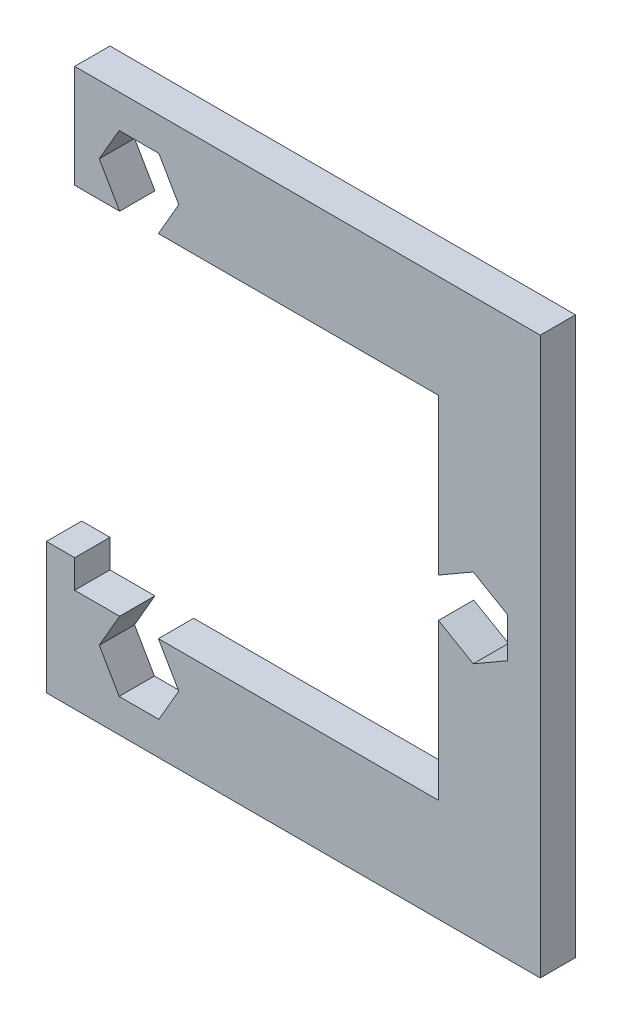
ISO-10303-21;
HEADER;
FILE_DESCRIPTION(('STEP AP214'),'2;1');
FILE_NAME('part.step','',(''),(''),'','','');
FILE_SCHEMA(('AUTOMOTIVE_DESIGN { 1 0 10303 214 1 1 1 1 }'));
ENDSEC;
DATA;
#1=APPLICATION_CONTEXT('core data for automotive mechanical design processes');
#2=APPLICATION_PROTOCOL_DEFINITION('international standard','automotive_design',2000,#1);
#3=PRODUCT_CONTEXT('',#1,'mechanical');
#4=PRODUCT('Part','Part','',(#3));
#5=PRODUCT_RELATED_PRODUCT_CATEGORY('part','',(#4));
#6=PRODUCT_DEFINITION_FORMATION('','',#4);
#7=PRODUCT_DEFINITION_CONTEXT('part definition',#1,'design');
#8=PRODUCT_DEFINITION('design','',#6,#7);
#9=PRODUCT_DEFINITION_SHAPE('','',#8);
#10=(LENGTH_UNIT() NAMED_UNIT(*) SI_UNIT(.MILLI.,.METRE.));
#11=(NAMED_UNIT(*) PLANE_ANGLE_UNIT() SI_UNIT($,.RADIAN.));
#12=(NAMED_UNIT(*) SI_UNIT($,.STERADIAN.) SOLID_ANGLE_UNIT());
#13=UNCERTAINTY_MEASURE_WITH_UNIT(LENGTH_MEASURE(1.E-05),#10,'distance_accuracy_value','');
#14=(GEOMETRIC_REPRESENTATION_CONTEXT(3) GLOBAL_UNCERTAINTY_ASSIGNED_CONTEXT((#13)) GLOBAL_UNIT_ASSIGNED_CONTEXT((#10,
#11,#12)) REPRESENTATION_CONTEXT('',''));
#15=CARTESIAN_POINT('',(0.,0.,0.));
#16=DIRECTION('',(0.,0.,1.));
#17=DIRECTION('',(1.,0.,0.));
#18=AXIS2_PLACEMENT_3D('',#15,#16,#17);
#19=CARTESIAN_POINT('',(7421.35798749575,3420.45663651415,3.175));
#20=DIRECTION('',(0.,1.,0.));
#21=DIRECTION('',(0.,0.,1.));
#22=AXIS2_PLACEMENT_3D('',#19,#20,#21);
#23=PLANE('',#22);
#24=DIRECTION('',(1.,0.,0.));
#25=VECTOR('',#24,1.);
#26=CARTESIAN_POINT('',(7421.35798749575,3420.45663651415,0.));
#27=LINE('',#26,#25);
#28=CARTESIAN_POINT('',(7421.35798749575,3420.45663651415,0.));
#29=VERTEX_POINT('',#28);
#30=CARTESIAN_POINT('',(7425.4040885721,3420.45663651415,0.));
#31=VERTEX_POINT('',#30);
#32=EDGE_CURVE('E249',#29,#31,#27,.T.);
#33=ORIENTED_EDGE('',*,*,#32,.T.);
#34=DIRECTION('',(0.,0.,-1.));
#35=VECTOR('',#34,1.);
#36=CARTESIAN_POINT('',(7425.4040885721,3420.45663651415,3.175));
#37=LINE('',#36,#35);
#38=CARTESIAN_POINT('',(7425.4040885721,3420.45663651415,3.175));
#39=VERTEX_POINT('',#38);
#40=EDGE_CURVE('E11',#39,#31,#37,.T.);
#41=ORIENTED_EDGE('',*,*,#40,.F.);
#42=DIRECTION('',(1.,0.,0.));
#43=VECTOR('',#42,1.);
#44=CARTESIAN_POINT('',(7421.35798749575,3420.45663651415,3.175));
#45=LINE('',#44,#43);
#46=CARTESIAN_POINT('',(7421.35798749575,3420.45663651415,3.175));
#47=VERTEX_POINT('',#46);
#48=EDGE_CURVE('E303',#47,#39,#45,.T.);
#49=ORIENTED_EDGE('',*,*,#48,.F.);
#50=DIRECTION('',(0.,0.,-1.));
#51=VECTOR('',#50,1.);
#52=CARTESIAN_POINT('',(7421.35798749575,3420.45663651415,3.175));
#53=LINE('',#52,#51);
#54=EDGE_CURVE('E245',#47,#29,#53,.T.);
#55=ORIENTED_EDGE('',*,*,#54,.T.);
#56=EDGE_LOOP('',(#33,#41,#49,#55));
#57=FACE_BOUND('',#56,.T.);
#58=ADVANCED_FACE('F33',(#57),#23,.F.);
#59=CARTESIAN_POINT('',(7423.57100146743,3423.63163651415,3.175));
#60=DIRECTION('',(-0.866025403784452,-0.499999999999977,0.));
#61=DIRECTION('',(0.499999999999977,-0.866025403784452,0.));
#62=AXIS2_PLACEMENT_3D('',#59,#60,#61);
#63=PLANE('',#62);
#64=DIRECTION('',(-0.499999999999977,0.866025403784452,0.));
#65=VECTOR('',#64,1.);
#66=CARTESIAN_POINT('',(7423.57100146743,3423.63163651415,0.));
#67=LINE('',#66,#65);
#68=CARTESIAN_POINT('',(7423.57100146743,3423.63163651415,0.));
#69=VERTEX_POINT('',#68);
#70=EDGE_CURVE('E252',#31,#69,#67,.T.);
#71=ORIENTED_EDGE('',*,*,#70,.T.);
#72=DIRECTION('',(0.,0.,-1.));
#73=VECTOR('',#72,1.);
#74=CARTESIAN_POINT('',(7423.57100146743,3423.63163651415,3.175));
#75=LINE('',#74,#73);
#76=CARTESIAN_POINT('',(7423.57100146743,3423.63163651415,3.175));
#77=VERTEX_POINT('',#76);
#78=EDGE_CURVE('E41',#77,#69,#75,.T.);
#79=ORIENTED_EDGE('',*,*,#78,.F.);
#80=DIRECTION('',(-0.499999999999977,0.866025403784452,0.));
#81=VECTOR('',#80,1.);
#82=CARTESIAN_POINT('',(7423.57100146743,3423.63163651415,3.175));
#83=LINE('',#82,#81);
#84=EDGE_CURVE('E152',#39,#77,#83,.T.);
#85=ORIENTED_EDGE('',*,*,#84,.F.);
#86=ORIENTED_EDGE('',*,*,#40,.T.);
#87=EDGE_LOOP('',(#71,#79,#85,#86));
#88=FACE_BOUND('',#87,.T.);
#89=ADVANCED_FACE('F461',(#88),#63,.F.);
#90=CARTESIAN_POINT('',(7425.36009448159,3426.73043651415,3.175));
#91=DIRECTION('',(-0.866025403784407,0.500000000000054,0.));
#92=DIRECTION('',(-0.500000000000055,-0.866025403784407,0.));
#93=AXIS2_PLACEMENT_3D('',#90,#91,#92);
#94=PLANE('',#93);
#95=DIRECTION('',(0.500000000000055,0.866025403784407,0.));
#96=VECTOR('',#95,1.);
#97=CARTESIAN_POINT('',(7425.36009448159,3426.73043651415,0.));
#98=LINE('',#97,#96);
#99=CARTESIAN_POINT('',(7425.36009448159,3426.73043651415,0.));
#100=VERTEX_POINT('',#99);
#101=EDGE_CURVE('E254',#69,#100,#98,.T.);
#102=ORIENTED_EDGE('',*,*,#101,.T.);
#103=DIRECTION('',(0.,0.,-1.));
#104=VECTOR('',#103,1.);
#105=CARTESIAN_POINT('',(7425.36009448159,3426.73043651415,3.175));
#106=LINE('',#105,#104);
#107=CARTESIAN_POINT('',(7425.36009448159,3426.73043651415,3.175));
#108=VERTEX_POINT('',#107);
#109=EDGE_CURVE('E370',#108,#100,#106,.T.);
#110=ORIENTED_EDGE('',*,*,#109,.F.);
#111=DIRECTION('',(0.500000000000055,0.866025403784407,0.));
#112=VECTOR('',#111,1.);
#113=CARTESIAN_POINT('',(7425.36009448159,3426.73043651415,3.175));
#114=LINE('',#113,#112);
#115=EDGE_CURVE('E378',#77,#108,#114,.T.);
#116=ORIENTED_EDGE('',*,*,#115,.F.);
#117=ORIENTED_EDGE('',*,*,#78,.T.);
#118=EDGE_LOOP('',(#102,#110,#116,#117));
#119=FACE_BOUND('',#118,.T.);
#120=ADVANCED_FACE('F376',(#119),#94,.F.);
#121=CARTESIAN_POINT('',(7428.93828050992,3426.73043651415,3.175));
#122=DIRECTION('',(0.,1.,0.));
#123=DIRECTION('',(0.,0.,1.));
#124=AXIS2_PLACEMENT_3D('',#121,#122,#123);
#125=PLANE('',#124);
#126=DIRECTION('',(1.,0.,0.));
#127=VECTOR('',#126,1.);
#128=CARTESIAN_POINT('',(7428.93828050992,3426.73043651415,0.));
#129=LINE('',#128,#127);
#130=CARTESIAN_POINT('',(7428.93828050992,3426.73043651415,0.));
#131=VERTEX_POINT('',#130);
#132=EDGE_CURVE('E256',#100,#131,#129,.T.);
#133=ORIENTED_EDGE('',*,*,#132,.T.);
#134=DIRECTION('',(0.,0.,-1.));
#135=VECTOR('',#134,1.);
#136=CARTESIAN_POINT('',(7428.93828050992,3426.73043651415,3.175));
#137=LINE('',#136,#135);
#138=CARTESIAN_POINT('',(7428.93828050992,3426.73043651415,3.175));
#139=VERTEX_POINT('',#138);
#140=EDGE_CURVE('E367',#139,#131,#137,.T.);
#141=ORIENTED_EDGE('',*,*,#140,.F.);
#142=DIRECTION('',(1.,0.,0.));
#143=VECTOR('',#142,1.);
#144=CARTESIAN_POINT('',(7428.93828050992,3426.73043651415,3.175));
#145=LINE('',#144,#143);
#146=EDGE_CURVE('E396',#108,#139,#145,.T.);
#147=ORIENTED_EDGE('',*,*,#146,.F.);
#148=ORIENTED_EDGE('',*,*,#109,.T.);
#149=EDGE_LOOP('',(#133,#141,#147,#148));
#150=FACE_BOUND('',#149,.T.);
#151=ADVANCED_FACE('F387',(#150),#125,.F.);
#152=CARTESIAN_POINT('',(7430.72737352408,3423.63163651415,3.175));
#153=DIRECTION('',(0.866025403784407,0.500000000000054,0.));
#154=DIRECTION('',(-0.500000000000055,0.866025403784407,0.));
#155=AXIS2_PLACEMENT_3D('',#152,#153,#154);
#156=PLANE('',#155);
#157=DIRECTION('',(0.500000000000055,-0.866025403784407,0.));
#158=VECTOR('',#157,1.);
#159=CARTESIAN_POINT('',(7430.72737352408,3423.63163651415,0.));
#160=LINE('',#159,#158);
#161=CARTESIAN_POINT('',(7430.72737352408,3423.63163651415,0.));
#162=VERTEX_POINT('',#161);
#163=EDGE_CURVE('E258',#131,#162,#160,.T.);
#164=ORIENTED_EDGE('',*,*,#163,.T.);
#165=DIRECTION('',(0.,0.,-1.));
#166=VECTOR('',#165,1.);
#167=CARTESIAN_POINT('',(7430.72737352408,3423.63163651415,3.175));
#168=LINE('',#167,#166);
#169=CARTESIAN_POINT('',(7430.72737352408,3423.63163651415,3.175));
#170=VERTEX_POINT('',#169);
#171=EDGE_CURVE('E364',#170,#162,#168,.T.);
#172=ORIENTED_EDGE('',*,*,#171,.F.);
#173=DIRECTION('',(0.500000000000055,-0.866025403784407,0.));
#174=VECTOR('',#173,1.);
#175=CARTESIAN_POINT('',(7430.72737352408,3423.63163651415,3.175));
#176=LINE('',#175,#174);
#177=EDGE_CURVE('E393',#139,#170,#176,.T.);
#178=ORIENTED_EDGE('',*,*,#177,.F.);
#179=ORIENTED_EDGE('',*,*,#140,.T.);
#180=EDGE_LOOP('',(#164,#172,#178,#179));
#181=FACE_BOUND('',#180,.T.);
#182=ADVANCED_FACE('F391',(#181),#156,.F.);
#183=CARTESIAN_POINT('',(7428.89428641941,3420.45663651415,3.175));
#184=DIRECTION('',(0.866025403784452,-0.499999999999977,0.));
#185=DIRECTION('',(0.499999999999977,0.866025403784452,0.));
#186=AXIS2_PLACEMENT_3D('',#183,#184,#185);
#187=PLANE('',#186);
#188=DIRECTION('',(-0.499999999999977,-0.866025403784452,0.));
#189=VECTOR('',#188,1.);
#190=CARTESIAN_POINT('',(7428.89428641941,3420.45663651415,0.));
#191=LINE('',#190,#189);
#192=CARTESIAN_POINT('',(7428.89428641941,3420.45663651415,0.));
#193=VERTEX_POINT('',#192);
#194=EDGE_CURVE('E260',#162,#193,#191,.T.);
#195=ORIENTED_EDGE('',*,*,#194,.T.);
#196=DIRECTION('',(0.,0.,-1.));
#197=VECTOR('',#196,1.);
#198=CARTESIAN_POINT('',(7428.89428641941,3420.45663651415,3.175));
#199=LINE('',#198,#197);
#200=CARTESIAN_POINT('',(7428.89428641941,3420.45663651415,3.175));
#201=VERTEX_POINT('',#200);
#202=EDGE_CURVE('E361',#201,#193,#199,.T.);
#203=ORIENTED_EDGE('',*,*,#202,.F.);
#204=DIRECTION('',(-0.499999999999977,-0.866025403784452,0.));
#205=VECTOR('',#204,1.);
#206=CARTESIAN_POINT('',(7428.89428641941,3420.45663651415,3.175));
#207=LINE('',#206,#205);
#208=EDGE_CURVE('E395',#170,#201,#207,.T.);
#209=ORIENTED_EDGE('',*,*,#208,.F.);
#210=ORIENTED_EDGE('',*,*,#171,.T.);
#211=EDGE_LOOP('',(#195,#203,#209,#210));
#212=FACE_BOUND('',#211,.T.);
#213=ADVANCED_FACE('F474',(#212),#187,.F.);
#214=CARTESIAN_POINT('',(7428.89428641941,3420.45663651415,3.175));
#215=DIRECTION('',(0.,1.,0.));
#216=DIRECTION('',(0.,0.,1.));
#217=AXIS2_PLACEMENT_3D('',#214,#215,#216);
#218=PLANE('',#217);
#219=DIRECTION('',(1.,0.,0.));
#220=VECTOR('',#219,1.);
#221=CARTESIAN_POINT('',(7428.89428641941,3420.45663651415,0.));
#222=LINE('',#221,#220);
#223=CARTESIAN_POINT('',(7454.09858749575,3420.45663651415,0.));
#224=VERTEX_POINT('',#223);
#225=EDGE_CURVE('E262',#193,#224,#222,.T.);
#226=ORIENTED_EDGE('',*,*,#225,.T.);
#227=DIRECTION('',(0.,0.,-1.));
#228=VECTOR('',#227,1.);
#229=CARTESIAN_POINT('',(7454.09858749575,3420.45663651415,3.175));
#230=LINE('',#229,#228);
#231=CARTESIAN_POINT('',(7454.09858749575,3420.45663651415,3.175));
#232=VERTEX_POINT('',#231);
#233=EDGE_CURVE('E358',#232,#224,#230,.T.);
#234=ORIENTED_EDGE('',*,*,#233,.F.);
#235=DIRECTION('',(1.,0.,0.));
#236=VECTOR('',#235,1.);
#237=CARTESIAN_POINT('',(7428.89428641941,3420.45663651415,3.175));
#238=LINE('',#237,#236);
#239=EDGE_CURVE('E398',#201,#232,#238,.T.);
#240=ORIENTED_EDGE('',*,*,#239,.F.);
#241=ORIENTED_EDGE('',*,*,#202,.T.);
#242=EDGE_LOOP('',(#226,#234,#240,#241));
#243=FACE_BOUND('',#242,.T.);
#244=ADVANCED_FACE('F477',(#243),#218,.F.);
#245=CARTESIAN_POINT('',(7454.09858749575,3420.45663651415,3.175));
#246=DIRECTION('',(1.,0.,0.));
#247=DIRECTION('',(0.,0.,-1.));
#248=AXIS2_PLACEMENT_3D('',#245,#246,#247);
#249=PLANE('',#248);
#250=DIRECTION('',(0.,-1.,0.));
#251=VECTOR('',#250,1.);
#252=CARTESIAN_POINT('',(7454.09858749575,3420.45663651415,0.));
#253=LINE('',#252,#251);
#254=CARTESIAN_POINT('',(7454.09858749575,3406.43770614274,0.));
#255=VERTEX_POINT('',#254);
#256=EDGE_CURVE('E264',#224,#255,#253,.T.);
#257=ORIENTED_EDGE('',*,*,#256,.T.);
#258=DIRECTION('',(0.,0.,-1.));
#259=VECTOR('',#258,1.);
#260=CARTESIAN_POINT('',(7454.09858749575,3406.43770614274,3.175));
#261=LINE('',#260,#259);
#262=CARTESIAN_POINT('',(7454.09858749575,3406.43770614274,3.175));
#263=VERTEX_POINT('',#262);
#264=EDGE_CURVE('E355',#263,#255,#261,.T.);
#265=ORIENTED_EDGE('',*,*,#264,.F.);
#266=DIRECTION('',(0.,-1.,0.));
#267=VECTOR('',#266,1.);
#268=CARTESIAN_POINT('',(7454.09858749575,3420.45663651415,3.175));
#269=LINE('',#268,#267);
#270=EDGE_CURVE('E404',#232,#263,#269,.T.);
#271=ORIENTED_EDGE('',*,*,#270,.F.);
#272=ORIENTED_EDGE('',*,*,#233,.T.);
#273=EDGE_LOOP('',(#257,#265,#271,#272));
#274=FACE_BOUND('',#273,.T.);
#275=ADVANCED_FACE('F481',(#274),#249,.F.);
#276=CARTESIAN_POINT('',(7457.23535991344,3408.24872254248,3.175));
#277=DIRECTION('',(-0.500000000000083,0.866025403784391,0.));
#278=DIRECTION('',(-0.866025403784391,-0.500000000000083,0.));
#279=AXIS2_PLACEMENT_3D('',#276,#277,#278);
#280=PLANE('',#279);
#281=DIRECTION('',(0.866025403784391,0.500000000000083,0.));
#282=VECTOR('',#281,1.);
#283=CARTESIAN_POINT('',(7457.23535991344,3408.24872254248,0.));
#284=LINE('',#283,#282);
#285=CARTESIAN_POINT('',(7457.23535991344,3408.24872254248,0.));
#286=VERTEX_POINT('',#285);
#287=EDGE_CURVE('E266',#255,#286,#284,.T.);
#288=ORIENTED_EDGE('',*,*,#287,.T.);
#289=DIRECTION('',(0.,0.,-1.));
#290=VECTOR('',#289,1.);
#291=CARTESIAN_POINT('',(7457.23535991344,3408.24872254248,3.175));
#292=LINE('',#291,#290);
#293=CARTESIAN_POINT('',(7457.23535991344,3408.24872254248,3.175));
#294=VERTEX_POINT('',#293);
#295=EDGE_CURVE('E352',#294,#286,#292,.T.);
#296=ORIENTED_EDGE('',*,*,#295,.F.);
#297=DIRECTION('',(0.866025403784391,0.500000000000083,0.));
#298=VECTOR('',#297,1.);
#299=CARTESIAN_POINT('',(7457.23535991344,3408.24872254248,3.175));
#300=LINE('',#299,#298);
#301=EDGE_CURVE('E406',#263,#294,#300,.T.);
#302=ORIENTED_EDGE('',*,*,#301,.F.);
#303=ORIENTED_EDGE('',*,*,#264,.T.);
#304=EDGE_LOOP('',(#288,#296,#302,#303));
#305=FACE_BOUND('',#304,.T.);
#306=ADVANCED_FACE('F485',(#305),#280,.F.);
#307=CARTESIAN_POINT('',(7460.33415991344,3406.45962952832,3.175));
#308=DIRECTION('',(0.500000000000001,0.866025403784438,0.));
#309=DIRECTION('',(-0.866025403784438,0.500000000000001,0.));
#310=AXIS2_PLACEMENT_3D('',#307,#308,#309);
#311=PLANE('',#310);
#312=DIRECTION('',(0.866025403784438,-0.500000000000001,0.));
#313=VECTOR('',#312,1.);
#314=CARTESIAN_POINT('',(7460.33415991344,3406.45962952832,0.));
#315=LINE('',#314,#313);
#316=CARTESIAN_POINT('',(7460.33415991344,3406.45962952832,0.));
#317=VERTEX_POINT('',#316);
#318=EDGE_CURVE('E268',#286,#317,#315,.T.);
#319=ORIENTED_EDGE('',*,*,#318,.T.);
#320=DIRECTION('',(0.,0.,-1.));
#321=VECTOR('',#320,1.);
#322=CARTESIAN_POINT('',(7460.33415991344,3406.45962952832,3.175));
#323=LINE('',#322,#321);
#324=CARTESIAN_POINT('',(7460.33415991344,3406.45962952832,3.175));
#325=VERTEX_POINT('',#324);
#326=EDGE_CURVE('E349',#325,#317,#323,.T.);
#327=ORIENTED_EDGE('',*,*,#326,.F.);
#328=DIRECTION('',(0.866025403784438,-0.500000000000001,0.));
#329=VECTOR('',#328,1.);
#330=CARTESIAN_POINT('',(7460.33415991344,3406.45962952832,3.175));
#331=LINE('',#330,#329);
#332=EDGE_CURVE('E408',#294,#325,#331,.T.);
#333=ORIENTED_EDGE('',*,*,#332,.F.);
#334=ORIENTED_EDGE('',*,*,#295,.T.);
#335=EDGE_LOOP('',(#319,#327,#333,#334));
#336=FACE_BOUND('',#335,.T.);
#337=ADVANCED_FACE('F489',(#336),#311,.F.);
#338=CARTESIAN_POINT('',(7460.33415991344,3402.88144349999,3.175));
#339=DIRECTION('',(1.,0.,0.));
#340=DIRECTION('',(0.,0.,-1.));
#341=AXIS2_PLACEMENT_3D('',#338,#339,#340);
#342=PLANE('',#341);
#343=DIRECTION('',(0.,-1.,0.));
#344=VECTOR('',#343,1.);
#345=CARTESIAN_POINT('',(7460.33415991344,3402.88144349999,0.));
#346=LINE('',#345,#344);
#347=CARTESIAN_POINT('',(7460.33415991344,3402.88144349999,0.));
#348=VERTEX_POINT('',#347);
#349=EDGE_CURVE('E270',#317,#348,#346,.T.);
#350=ORIENTED_EDGE('',*,*,#349,.T.);
#351=DIRECTION('',(0.,0.,-1.));
#352=VECTOR('',#351,1.);
#353=CARTESIAN_POINT('',(7460.33415991344,3402.88144349999,3.175));
#354=LINE('',#353,#352);
#355=CARTESIAN_POINT('',(7460.33415991344,3402.88144349999,3.175));
#356=VERTEX_POINT('',#355);
#357=EDGE_CURVE('E346',#356,#348,#354,.T.);
#358=ORIENTED_EDGE('',*,*,#357,.F.);
#359=DIRECTION('',(0.,-1.,0.));
#360=VECTOR('',#359,1.);
#361=CARTESIAN_POINT('',(7460.33415991344,3402.88144349999,3.175));
#362=LINE('',#361,#360);
#363=EDGE_CURVE('E410',#325,#356,#362,.T.);
#364=ORIENTED_EDGE('',*,*,#363,.F.);
#365=ORIENTED_EDGE('',*,*,#326,.T.);
#366=EDGE_LOOP('',(#350,#358,#364,#365));
#367=FACE_BOUND('',#366,.T.);
#368=ADVANCED_FACE('F493',(#367),#342,.F.);
#369=CARTESIAN_POINT('',(7457.23535991344,3401.09235048582,3.175));
#370=DIRECTION('',(0.500000000000001,-0.866025403784438,0.));
#371=DIRECTION('',(0.866025403784438,0.500000000000001,0.));
#372=AXIS2_PLACEMENT_3D('',#369,#370,#371);
#373=PLANE('',#372);
#374=DIRECTION('',(-0.866025403784438,-0.500000000000001,0.));
#375=VECTOR('',#374,1.);
#376=CARTESIAN_POINT('',(7457.23535991344,3401.09235048582,0.));
#377=LINE('',#376,#375);
#378=CARTESIAN_POINT('',(7457.23535991344,3401.09235048582,0.));
#379=VERTEX_POINT('',#378);
#380=EDGE_CURVE('E272',#348,#379,#377,.T.);
#381=ORIENTED_EDGE('',*,*,#380,.T.);
#382=DIRECTION('',(0.,0.,-1.));
#383=VECTOR('',#382,1.);
#384=CARTESIAN_POINT('',(7457.23535991344,3401.09235048582,3.175));
#385=LINE('',#384,#383);
#386=CARTESIAN_POINT('',(7457.23535991344,3401.09235048582,3.175));
#387=VERTEX_POINT('',#386);
#388=EDGE_CURVE('E343',#387,#379,#385,.T.);
#389=ORIENTED_EDGE('',*,*,#388,.F.);
#390=DIRECTION('',(-0.866025403784438,-0.500000000000001,0.));
#391=VECTOR('',#390,1.);
#392=CARTESIAN_POINT('',(7457.23535991344,3401.09235048582,3.175));
#393=LINE('',#392,#391);
#394=EDGE_CURVE('E412',#356,#387,#393,.T.);
#395=ORIENTED_EDGE('',*,*,#394,.F.);
#396=ORIENTED_EDGE('',*,*,#357,.T.);
#397=EDGE_LOOP('',(#381,#389,#395,#396));
#398=FACE_BOUND('',#397,.T.);
#399=ADVANCED_FACE('F497',(#398),#373,.F.);
#400=CARTESIAN_POINT('',(7454.09858749575,3402.90336688556,3.175));
#401=DIRECTION('',(-0.500000000000083,-0.866025403784391,0.));
#402=DIRECTION('',(0.866025403784391,-0.500000000000083,0.));
#403=AXIS2_PLACEMENT_3D('',#400,#401,#402);
#404=PLANE('',#403);
#405=DIRECTION('',(-0.866025403784391,0.500000000000083,0.));
#406=VECTOR('',#405,1.);
#407=CARTESIAN_POINT('',(7454.09858749575,3402.90336688556,0.));
#408=LINE('',#407,#406);
#409=CARTESIAN_POINT('',(7454.09858749575,3402.90336688556,0.));
#410=VERTEX_POINT('',#409);
#411=EDGE_CURVE('E274',#379,#410,#408,.T.);
#412=ORIENTED_EDGE('',*,*,#411,.T.);
#413=DIRECTION('',(0.,0.,-1.));
#414=VECTOR('',#413,1.);
#415=CARTESIAN_POINT('',(7454.09858749575,3402.90336688556,3.175));
#416=LINE('',#415,#414);
#417=CARTESIAN_POINT('',(7454.09858749575,3402.90336688556,3.175));
#418=VERTEX_POINT('',#417);
#419=EDGE_CURVE('E340',#418,#410,#416,.T.);
#420=ORIENTED_EDGE('',*,*,#419,.F.);
#421=DIRECTION('',(-0.866025403784391,0.500000000000083,0.));
#422=VECTOR('',#421,1.);
#423=CARTESIAN_POINT('',(7454.09858749575,3402.90336688556,3.175));
#424=LINE('',#423,#422);
#425=EDGE_CURVE('E414',#387,#418,#424,.T.);
#426=ORIENTED_EDGE('',*,*,#425,.F.);
#427=ORIENTED_EDGE('',*,*,#388,.T.);
#428=EDGE_LOOP('',(#412,#420,#426,#427));
#429=FACE_BOUND('',#428,.T.);
#430=ADVANCED_FACE('F501',(#429),#404,.F.);
#431=CARTESIAN_POINT('',(7454.09858749575,3402.90336688556,3.175));
#432=DIRECTION('',(1.,0.,0.));
#433=DIRECTION('',(0.,0.,-1.));
#434=AXIS2_PLACEMENT_3D('',#431,#432,#433);
#435=PLANE('',#434);
#436=DIRECTION('',(0.,-1.,0.));
#437=VECTOR('',#436,1.);
#438=CARTESIAN_POINT('',(7454.09858749575,3402.90336688556,0.));
#439=LINE('',#438,#437);
#440=CARTESIAN_POINT('',(7454.09858749575,3388.88443651415,0.));
#441=VERTEX_POINT('',#440);
#442=EDGE_CURVE('E276',#410,#441,#439,.T.);
#443=ORIENTED_EDGE('',*,*,#442,.T.);
#444=DIRECTION('',(0.,0.,-1.));
#445=VECTOR('',#444,1.);
#446=CARTESIAN_POINT('',(7454.09858749575,3388.88443651415,3.175));
#447=LINE('',#446,#445);
#448=CARTESIAN_POINT('',(7454.09858749575,3388.88443651415,3.175));
#449=VERTEX_POINT('',#448);
#450=EDGE_CURVE('E337',#449,#441,#447,.T.);
#451=ORIENTED_EDGE('',*,*,#450,.F.);
#452=DIRECTION('',(0.,-1.,0.));
#453=VECTOR('',#452,1.);
#454=CARTESIAN_POINT('',(7454.09858749575,3402.90336688556,3.175));
#455=LINE('',#454,#453);
#456=EDGE_CURVE('E416',#418,#449,#455,.T.);
#457=ORIENTED_EDGE('',*,*,#456,.F.);
#458=ORIENTED_EDGE('',*,*,#419,.T.);
#459=EDGE_LOOP('',(#443,#451,#457,#458));
#460=FACE_BOUND('',#459,.T.);
#461=ADVANCED_FACE('F505',(#460),#435,.F.);
#462=CARTESIAN_POINT('',(7454.09858749575,3388.88443651415,3.175));
#463=DIRECTION('',(0.,-1.,0.));
#464=DIRECTION('',(0.,0.,-1.));
#465=AXIS2_PLACEMENT_3D('',#462,#463,#464);
#466=PLANE('',#465);
#467=DIRECTION('',(-1.,0.,0.));
#468=VECTOR('',#467,1.);
#469=CARTESIAN_POINT('',(7454.09858749575,3388.88443651415,0.));
#470=LINE('',#469,#468);
#471=CARTESIAN_POINT('',(7428.89428641941,3388.88443651415,0.));
#472=VERTEX_POINT('',#471);
#473=EDGE_CURVE('E278',#441,#472,#470,.T.);
#474=ORIENTED_EDGE('',*,*,#473,.T.);
#475=DIRECTION('',(0.,0.,-1.));
#476=VECTOR('',#475,1.);
#477=CARTESIAN_POINT('',(7428.89428641941,3388.88443651415,3.175));
#478=LINE('',#477,#476);
#479=CARTESIAN_POINT('',(7428.89428641941,3388.88443651415,3.175));
#480=VERTEX_POINT('',#479);
#481=EDGE_CURVE('E334',#480,#472,#478,.T.);
#482=ORIENTED_EDGE('',*,*,#481,.F.);
#483=DIRECTION('',(-1.,0.,0.));
#484=VECTOR('',#483,1.);
#485=CARTESIAN_POINT('',(7454.09858749575,3388.88443651415,3.175));
#486=LINE('',#485,#484);
#487=EDGE_CURVE('E418',#449,#480,#486,.T.);
#488=ORIENTED_EDGE('',*,*,#487,.F.);
#489=ORIENTED_EDGE('',*,*,#450,.T.);
#490=EDGE_LOOP('',(#474,#482,#488,#489));
#491=FACE_BOUND('',#490,.T.);
#492=ADVANCED_FACE('F509',(#491),#466,.F.);
#493=CARTESIAN_POINT('',(7430.72737352408,3385.70943651415,3.175));
#494=DIRECTION('',(0.866025403784452,0.499999999999977,0.));
#495=DIRECTION('',(-0.499999999999977,0.866025403784452,0.));
#496=AXIS2_PLACEMENT_3D('',#493,#494,#495);
#497=PLANE('',#496);
#498=DIRECTION('',(0.499999999999977,-0.866025403784452,0.));
#499=VECTOR('',#498,1.);
#500=CARTESIAN_POINT('',(7430.72737352408,3385.70943651415,0.));
#501=LINE('',#500,#499);
#502=CARTESIAN_POINT('',(7430.72737352408,3385.70943651415,0.));
#503=VERTEX_POINT('',#502);
#504=EDGE_CURVE('E280',#472,#503,#501,.T.);
#505=ORIENTED_EDGE('',*,*,#504,.T.);
#506=DIRECTION('',(0.,0.,-1.));
#507=VECTOR('',#506,1.);
#508=CARTESIAN_POINT('',(7430.72737352408,3385.70943651415,3.175));
#509=LINE('',#508,#507);
#510=CARTESIAN_POINT('',(7430.72737352408,3385.70943651415,3.175));
#511=VERTEX_POINT('',#510);
#512=EDGE_CURVE('E331',#511,#503,#509,.T.);
#513=ORIENTED_EDGE('',*,*,#512,.F.);
#514=DIRECTION('',(0.499999999999977,-0.866025403784452,0.));
#515=VECTOR('',#514,1.);
#516=CARTESIAN_POINT('',(7430.72737352408,3385.70943651415,3.175));
#517=LINE('',#516,#515);
#518=EDGE_CURVE('E420',#480,#511,#517,.T.);
#519=ORIENTED_EDGE('',*,*,#518,.F.);
#520=ORIENTED_EDGE('',*,*,#481,.T.);
#521=EDGE_LOOP('',(#505,#513,#519,#520));
#522=FACE_BOUND('',#521,.T.);
#523=ADVANCED_FACE('F513',(#522),#497,.F.);
#524=CARTESIAN_POINT('',(7428.93828050992,3382.61063651415,3.175));
#525=DIRECTION('',(0.866025403784407,-0.500000000000054,0.));
#526=DIRECTION('',(0.500000000000055,0.866025403784407,0.));
#527=AXIS2_PLACEMENT_3D('',#524,#525,#526);
#528=PLANE('',#527);
#529=DIRECTION('',(-0.500000000000055,-0.866025403784407,0.));
#530=VECTOR('',#529,1.);
#531=CARTESIAN_POINT('',(7428.93828050992,3382.61063651415,0.));
#532=LINE('',#531,#530);
#533=CARTESIAN_POINT('',(7428.93828050992,3382.61063651415,0.));
#534=VERTEX_POINT('',#533);
#535=EDGE_CURVE('E282',#503,#534,#532,.T.);
#536=ORIENTED_EDGE('',*,*,#535,.T.);
#537=DIRECTION('',(0.,0.,-1.));
#538=VECTOR('',#537,1.);
#539=CARTESIAN_POINT('',(7428.93828050992,3382.61063651415,3.175));
#540=LINE('',#539,#538);
#541=CARTESIAN_POINT('',(7428.93828050992,3382.61063651415,3.175));
#542=VERTEX_POINT('',#541);
#543=EDGE_CURVE('E328',#542,#534,#540,.T.);
#544=ORIENTED_EDGE('',*,*,#543,.F.);
#545=DIRECTION('',(-0.500000000000055,-0.866025403784407,0.));
#546=VECTOR('',#545,1.);
#547=CARTESIAN_POINT('',(7428.93828050992,3382.61063651415,3.175));
#548=LINE('',#547,#546);
#549=EDGE_CURVE('E422',#511,#542,#548,.T.);
#550=ORIENTED_EDGE('',*,*,#549,.F.);
#551=ORIENTED_EDGE('',*,*,#512,.T.);
#552=EDGE_LOOP('',(#536,#544,#550,#551));
#553=FACE_BOUND('',#552,.T.);
#554=ADVANCED_FACE('F517',(#553),#528,.F.);
#555=CARTESIAN_POINT('',(7425.36009448159,3382.61063651415,3.175));
#556=DIRECTION('',(0.,-1.,0.));
#557=DIRECTION('',(0.,0.,-1.));
#558=AXIS2_PLACEMENT_3D('',#555,#556,#557);
#559=PLANE('',#558);
#560=DIRECTION('',(-1.,0.,0.));
#561=VECTOR('',#560,1.);
#562=CARTESIAN_POINT('',(7425.36009448159,3382.61063651415,0.));
#563=LINE('',#562,#561);
#564=CARTESIAN_POINT('',(7425.36009448159,3382.61063651415,0.));
#565=VERTEX_POINT('',#564);
#566=EDGE_CURVE('E284',#534,#565,#563,.T.);
#567=ORIENTED_EDGE('',*,*,#566,.T.);
#568=DIRECTION('',(0.,0.,-1.));
#569=VECTOR('',#568,1.);
#570=CARTESIAN_POINT('',(7425.36009448159,3382.61063651415,3.175));
#571=LINE('',#570,#569);
#572=CARTESIAN_POINT('',(7425.36009448159,3382.61063651415,3.175));
#573=VERTEX_POINT('',#572);
#574=EDGE_CURVE('E325',#573,#565,#571,.T.);
#575=ORIENTED_EDGE('',*,*,#574,.F.);
#576=DIRECTION('',(-1.,0.,0.));
#577=VECTOR('',#576,1.);
#578=CARTESIAN_POINT('',(7425.36009448159,3382.61063651415,3.175));
#579=LINE('',#578,#577);
#580=EDGE_CURVE('E424',#542,#573,#579,.T.);
#581=ORIENTED_EDGE('',*,*,#580,.F.);
#582=ORIENTED_EDGE('',*,*,#543,.T.);
#583=EDGE_LOOP('',(#567,#575,#581,#582));
#584=FACE_BOUND('',#583,.T.);
#585=ADVANCED_FACE('F521',(#584),#559,.F.);
#586=CARTESIAN_POINT('',(7423.57100146743,3385.70943651415,3.175));
#587=DIRECTION('',(-0.866025403784407,-0.500000000000054,0.));
#588=DIRECTION('',(0.500000000000055,-0.866025403784407,0.));
#589=AXIS2_PLACEMENT_3D('',#586,#587,#588);
#590=PLANE('',#589);
#591=DIRECTION('',(-0.500000000000055,0.866025403784407,0.));
#592=VECTOR('',#591,1.);
#593=CARTESIAN_POINT('',(7423.57100146743,3385.70943651415,0.));
#594=LINE('',#593,#592);
#595=CARTESIAN_POINT('',(7423.57100146743,3385.70943651415,0.));
#596=VERTEX_POINT('',#595);
#597=EDGE_CURVE('E286',#565,#596,#594,.T.);
#598=ORIENTED_EDGE('',*,*,#597,.T.);
#599=DIRECTION('',(0.,0.,-1.));
#600=VECTOR('',#599,1.);
#601=CARTESIAN_POINT('',(7423.57100146743,3385.70943651415,3.175));
#602=LINE('',#601,#600);
#603=CARTESIAN_POINT('',(7423.57100146743,3385.70943651415,3.175));
#604=VERTEX_POINT('',#603);
#605=EDGE_CURVE('E322',#604,#596,#602,.T.);
#606=ORIENTED_EDGE('',*,*,#605,.F.);
#607=DIRECTION('',(-0.500000000000055,0.866025403784407,0.));
#608=VECTOR('',#607,1.);
#609=CARTESIAN_POINT('',(7423.57100146743,3385.70943651415,3.175));
#610=LINE('',#609,#608);
#611=EDGE_CURVE('E426',#573,#604,#610,.T.);
#612=ORIENTED_EDGE('',*,*,#611,.F.);
#613=ORIENTED_EDGE('',*,*,#574,.T.);
#614=EDGE_LOOP('',(#598,#606,#612,#613));
#615=FACE_BOUND('',#614,.T.);
#616=ADVANCED_FACE('F525',(#615),#590,.F.);
#617=CARTESIAN_POINT('',(7425.4040885721,3388.88443651415,3.175));
#618=DIRECTION('',(-0.866025403784452,0.499999999999977,0.));
#619=DIRECTION('',(-0.499999999999977,-0.866025403784452,0.));
#620=AXIS2_PLACEMENT_3D('',#617,#618,#619);
#621=PLANE('',#620);
#622=DIRECTION('',(0.499999999999977,0.866025403784452,0.));
#623=VECTOR('',#622,1.);
#624=CARTESIAN_POINT('',(7425.4040885721,3388.88443651415,0.));
#625=LINE('',#624,#623);
#626=CARTESIAN_POINT('',(7425.4040885721,3388.88443651415,0.));
#627=VERTEX_POINT('',#626);
#628=EDGE_CURVE('E288',#596,#627,#625,.T.);
#629=ORIENTED_EDGE('',*,*,#628,.T.);
#630=DIRECTION('',(0.,0.,-1.));
#631=VECTOR('',#630,1.);
#632=CARTESIAN_POINT('',(7425.4040885721,3388.88443651415,3.175));
#633=LINE('',#632,#631);
#634=CARTESIAN_POINT('',(7425.4040885721,3388.88443651415,3.175));
#635=VERTEX_POINT('',#634);
#636=EDGE_CURVE('E319',#635,#627,#633,.T.);
#637=ORIENTED_EDGE('',*,*,#636,.F.);
#638=DIRECTION('',(0.499999999999977,0.866025403784452,0.));
#639=VECTOR('',#638,1.);
#640=CARTESIAN_POINT('',(7425.4040885721,3388.88443651415,3.175));
#641=LINE('',#640,#639);
#642=EDGE_CURVE('E428',#604,#635,#641,.T.);
#643=ORIENTED_EDGE('',*,*,#642,.F.);
#644=ORIENTED_EDGE('',*,*,#605,.T.);
#645=EDGE_LOOP('',(#629,#637,#643,#644));
#646=FACE_BOUND('',#645,.T.);
#647=ADVANCED_FACE('F529',(#646),#621,.F.);
#648=CARTESIAN_POINT('',(7425.4040885721,3388.88443651415,3.175));
#649=DIRECTION('',(0.,-1.,0.));
#650=DIRECTION('',(0.,0.,-1.));
#651=AXIS2_PLACEMENT_3D('',#648,#649,#650);
#652=PLANE('',#651);
#653=DIRECTION('',(-1.,0.,0.));
#654=VECTOR('',#653,1.);
#655=CARTESIAN_POINT('',(7425.4040885721,3388.88443651415,0.));
#656=LINE('',#655,#654);
#657=CARTESIAN_POINT('',(7421.35798749575,3388.88443651415,0.));
#658=VERTEX_POINT('',#657);
#659=EDGE_CURVE('E290',#627,#658,#656,.T.);
#660=ORIENTED_EDGE('',*,*,#659,.T.);
#661=DIRECTION('',(0.,0.,-1.));
#662=VECTOR('',#661,1.);
#663=CARTESIAN_POINT('',(7421.35798749575,3388.88443651415,3.175));
#664=LINE('',#663,#662);
#665=CARTESIAN_POINT('',(7421.35798749575,3388.88443651415,3.175));
#666=VERTEX_POINT('',#665);
#667=EDGE_CURVE('E316',#666,#658,#664,.T.);
#668=ORIENTED_EDGE('',*,*,#667,.F.);
#669=DIRECTION('',(-1.,0.,0.));
#670=VECTOR('',#669,1.);
#671=CARTESIAN_POINT('',(7425.4040885721,3388.88443651415,3.175));
#672=LINE('',#671,#670);
#673=EDGE_CURVE('E430',#635,#666,#672,.T.);
#674=ORIENTED_EDGE('',*,*,#673,.F.);
#675=ORIENTED_EDGE('',*,*,#636,.T.);
#676=EDGE_LOOP('',(#660,#668,#674,#675));
#677=FACE_BOUND('',#676,.T.);
#678=ADVANCED_FACE('F533',(#677),#652,.F.);
#679=CARTESIAN_POINT('',(7421.35798749575,3391.42443651415,3.175));
#680=DIRECTION('',(-1.,0.,0.));
#681=DIRECTION('',(0.,0.,1.));
#682=AXIS2_PLACEMENT_3D('',#679,#680,#681);
#683=PLANE('',#682);
#684=DIRECTION('',(0.,1.,0.));
#685=VECTOR('',#684,1.);
#686=CARTESIAN_POINT('',(7421.35798749575,3391.42443651415,0.));
#687=LINE('',#686,#685);
#688=CARTESIAN_POINT('',(7421.35798749575,3391.42443651415,0.));
#689=VERTEX_POINT('',#688);
#690=EDGE_CURVE('E292',#658,#689,#687,.T.);
#691=ORIENTED_EDGE('',*,*,#690,.T.);
#692=DIRECTION('',(0.,0.,-1.));
#693=VECTOR('',#692,1.);
#694=CARTESIAN_POINT('',(7421.35798749575,3391.42443651415,3.175));
#695=LINE('',#694,#693);
#696=CARTESIAN_POINT('',(7421.35798749575,3391.42443651415,3.175));
#697=VERTEX_POINT('',#696);
#698=EDGE_CURVE('E313',#697,#689,#695,.T.);
#699=ORIENTED_EDGE('',*,*,#698,.F.);
#700=DIRECTION('',(0.,1.,0.));
#701=VECTOR('',#700,1.);
#702=CARTESIAN_POINT('',(7421.35798749575,3391.42443651415,3.175));
#703=LINE('',#702,#701);
#704=EDGE_CURVE('E432',#666,#697,#703,.T.);
#705=ORIENTED_EDGE('',*,*,#704,.F.);
#706=ORIENTED_EDGE('',*,*,#667,.T.);
#707=EDGE_LOOP('',(#691,#699,#705,#706));
#708=FACE_BOUND('',#707,.T.);
#709=ADVANCED_FACE('F537',(#708),#683,.F.);
#710=CARTESIAN_POINT('',(7421.35798749575,3391.42443651415,3.175));
#711=DIRECTION('',(0.,-1.,0.));
#712=DIRECTION('',(0.,0.,-1.));
#713=AXIS2_PLACEMENT_3D('',#710,#711,#712);
#714=PLANE('',#713);
#715=DIRECTION('',(-1.,0.,0.));
#716=VECTOR('',#715,1.);
#717=CARTESIAN_POINT('',(7421.35798749575,3391.42443651415,0.));
#718=LINE('',#717,#716);
#719=CARTESIAN_POINT('',(7418.81798749575,3391.42443651415,0.));
#720=VERTEX_POINT('',#719);
#721=EDGE_CURVE('E294',#689,#720,#718,.T.);
#722=ORIENTED_EDGE('',*,*,#721,.T.);
#723=DIRECTION('',(0.,0.,-1.));
#724=VECTOR('',#723,1.);
#725=CARTESIAN_POINT('',(7418.81798749575,3391.42443651415,3.175));
#726=LINE('',#725,#724);
#727=CARTESIAN_POINT('',(7418.81798749575,3391.42443651415,3.175));
#728=VERTEX_POINT('',#727);
#729=EDGE_CURVE('E310',#728,#720,#726,.T.);
#730=ORIENTED_EDGE('',*,*,#729,.F.);
#731=DIRECTION('',(-1.,0.,0.));
#732=VECTOR('',#731,1.);
#733=CARTESIAN_POINT('',(7421.35798749575,3391.42443651415,3.175));
#734=LINE('',#733,#732);
#735=EDGE_CURVE('E434',#697,#728,#734,.T.);
#736=ORIENTED_EDGE('',*,*,#735,.F.);
#737=ORIENTED_EDGE('',*,*,#698,.T.);
#738=EDGE_LOOP('',(#722,#730,#736,#737));
#739=FACE_BOUND('',#738,.T.);
#740=ADVANCED_FACE('F541',(#739),#714,.F.);
#741=CARTESIAN_POINT('',(7418.81798749575,3379.61343651415,3.175));
#742=DIRECTION('',(1.,0.,0.));
#743=DIRECTION('',(0.,0.,-1.));
#744=AXIS2_PLACEMENT_3D('',#741,#742,#743);
#745=PLANE('',#744);
#746=DIRECTION('',(0.,-1.,0.));
#747=VECTOR('',#746,1.);
#748=CARTESIAN_POINT('',(7418.81798749575,3379.61343651415,0.));
#749=LINE('',#748,#747);
#750=CARTESIAN_POINT('',(7418.81798749575,3379.61343651415,0.));
#751=VERTEX_POINT('',#750);
#752=EDGE_CURVE('E296',#720,#751,#749,.T.);
#753=ORIENTED_EDGE('',*,*,#752,.T.);
#754=DIRECTION('',(0.,0.,-1.));
#755=VECTOR('',#754,1.);
#756=CARTESIAN_POINT('',(7418.81798749575,3379.61343651415,3.175));
#757=LINE('',#756,#755);
#758=CARTESIAN_POINT('',(7418.81798749575,3379.61343651415,3.175));
#759=VERTEX_POINT('',#758);
#760=EDGE_CURVE('E307',#759,#751,#757,.T.);
#761=ORIENTED_EDGE('',*,*,#760,.F.);
#762=DIRECTION('',(0.,-1.,0.));
#763=VECTOR('',#762,1.);
#764=CARTESIAN_POINT('',(7418.81798749575,3379.61343651415,3.175));
#765=LINE('',#764,#763);
#766=EDGE_CURVE('E436',#728,#759,#765,.T.);
#767=ORIENTED_EDGE('',*,*,#766,.F.);
#768=ORIENTED_EDGE('',*,*,#729,.T.);
#769=EDGE_LOOP('',(#753,#761,#767,#768));
#770=FACE_BOUND('',#769,.T.);
#771=ADVANCED_FACE('F442',(#770),#745,.F.);
#772=CARTESIAN_POINT('',(7418.81798749575,3379.61343651415,3.175));
#773=DIRECTION('',(0.,1.,0.));
#774=DIRECTION('',(0.,0.,1.));
#775=AXIS2_PLACEMENT_3D('',#772,#773,#774);
#776=PLANE('',#775);
#777=DIRECTION('',(1.,0.,0.));
#778=VECTOR('',#777,1.);
#779=CARTESIAN_POINT('',(7418.81798749575,3379.61343651415,0.));
#780=LINE('',#779,#778);
#781=CARTESIAN_POINT('',(7463.26798749575,3379.61343651415,0.));
#782=VERTEX_POINT('',#781);
#783=EDGE_CURVE('E298',#751,#782,#780,.T.);
#784=ORIENTED_EDGE('',*,*,#783,.T.);
#785=DIRECTION('',(0.,0.,-1.));
#786=VECTOR('',#785,1.);
#787=CARTESIAN_POINT('',(7463.26798749575,3379.61343651415,3.175));
#788=LINE('',#787,#786);
#789=CARTESIAN_POINT('',(7463.26798749575,3379.61343651415,3.175));
#790=VERTEX_POINT('',#789);
#791=EDGE_CURVE('E240',#790,#782,#788,.T.);
#792=ORIENTED_EDGE('',*,*,#791,.F.);
#793=DIRECTION('',(1.,0.,0.));
#794=VECTOR('',#793,1.);
#795=CARTESIAN_POINT('',(7418.81798749575,3379.61343651415,3.175));
#796=LINE('',#795,#794);
#797=EDGE_CURVE('E231',#759,#790,#796,.T.);
#798=ORIENTED_EDGE('',*,*,#797,.F.);
#799=ORIENTED_EDGE('',*,*,#760,.T.);
#800=EDGE_LOOP('',(#784,#792,#798,#799));
#801=FACE_BOUND('',#800,.T.);
#802=ADVANCED_FACE('F446',(#801),#776,.F.);
#803=CARTESIAN_POINT('',(7463.26798749575,3429.72763651415,3.175));
#804=DIRECTION('',(-1.,0.,0.));
#805=DIRECTION('',(0.,0.,1.));
#806=AXIS2_PLACEMENT_3D('',#803,#804,#805);
#807=PLANE('',#806);
#808=DIRECTION('',(0.,1.,0.));
#809=VECTOR('',#808,1.);
#810=CARTESIAN_POINT('',(7463.26798749575,3429.72763651415,0.));
#811=LINE('',#810,#809);
#812=CARTESIAN_POINT('',(7463.26798749575,3429.72763651415,0.));
#813=VERTEX_POINT('',#812);
#814=EDGE_CURVE('E239',#782,#813,#811,.T.);
#815=ORIENTED_EDGE('',*,*,#814,.T.);
#816=DIRECTION('',(0.,0.,-1.));
#817=VECTOR('',#816,1.);
#818=CARTESIAN_POINT('',(7463.26798749575,3429.72763651415,3.175));
#819=LINE('',#818,#817);
#820=CARTESIAN_POINT('',(7463.26798749575,3429.72763651415,3.175));
#821=VERTEX_POINT('',#820);
#822=EDGE_CURVE('E236',#821,#813,#819,.T.);
#823=ORIENTED_EDGE('',*,*,#822,.F.);
#824=DIRECTION('',(0.,1.,0.));
#825=VECTOR('',#824,1.);
#826=CARTESIAN_POINT('',(7463.26798749575,3429.72763651415,3.175));
#827=LINE('',#826,#825);
#828=EDGE_CURVE('E225',#790,#821,#827,.T.);
#829=ORIENTED_EDGE('',*,*,#828,.F.);
#830=ORIENTED_EDGE('',*,*,#791,.T.);
#831=EDGE_LOOP('',(#815,#823,#829,#830));
#832=FACE_BOUND('',#831,.T.);
#833=ADVANCED_FACE('F237',(#832),#807,.F.);
#834=CARTESIAN_POINT('',(7421.35798749575,3429.72763651415,3.175));
#835=DIRECTION('',(0.,-1.,0.));
#836=DIRECTION('',(0.,0.,-1.));
#837=AXIS2_PLACEMENT_3D('',#834,#835,#836);
#838=PLANE('',#837);
#839=DIRECTION('',(-1.,0.,0.));
#840=VECTOR('',#839,1.);
#841=CARTESIAN_POINT('',(7421.35798749575,3429.72763651415,0.));
#842=LINE('',#841,#840);
#843=CARTESIAN_POINT('',(7421.35798749575,3429.72763651415,0.));
#844=VERTEX_POINT('',#843);
#845=EDGE_CURVE('E138',#813,#844,#842,.T.);
#846=ORIENTED_EDGE('',*,*,#845,.T.);
#847=DIRECTION('',(0.,0.,-1.));
#848=VECTOR('',#847,1.);
#849=CARTESIAN_POINT('',(7421.35798749575,3429.72763651415,3.175));
#850=LINE('',#849,#848);
#851=CARTESIAN_POINT('',(7421.35798749575,3429.72763651415,3.175));
#852=VERTEX_POINT('',#851);
#853=EDGE_CURVE('E241',#852,#844,#850,.T.);
#854=ORIENTED_EDGE('',*,*,#853,.F.);
#855=DIRECTION('',(-1.,0.,0.));
#856=VECTOR('',#855,1.);
#857=CARTESIAN_POINT('',(7421.35798749575,3429.72763651415,3.175));
#858=LINE('',#857,#856);
#859=EDGE_CURVE('E229',#821,#852,#858,.T.);
#860=ORIENTED_EDGE('',*,*,#859,.F.);
#861=ORIENTED_EDGE('',*,*,#822,.T.);
#862=EDGE_LOOP('',(#846,#854,#860,#861));
#863=FACE_BOUND('',#862,.T.);
#864=ADVANCED_FACE('F243',(#863),#838,.F.);
#865=CARTESIAN_POINT('',(7421.35798749575,3420.45663651415,3.175));
#866=DIRECTION('',(1.,0.,0.));
#867=DIRECTION('',(0.,0.,-1.));
#868=AXIS2_PLACEMENT_3D('',#865,#866,#867);
#869=PLANE('',#868);
#870=DIRECTION('',(0.,-1.,0.));
#871=VECTOR('',#870,1.);
#872=CARTESIAN_POINT('',(7421.35798749575,3420.45663651415,0.));
#873=LINE('',#872,#871);
#874=EDGE_CURVE('E144',#844,#29,#873,.T.);
#875=ORIENTED_EDGE('',*,*,#874,.T.);
#876=ORIENTED_EDGE('',*,*,#54,.F.);
#877=DIRECTION('',(0.,-1.,0.));
#878=VECTOR('',#877,1.);
#879=CARTESIAN_POINT('',(7421.35798749575,3420.45663651415,3.175));
#880=LINE('',#879,#878);
#881=EDGE_CURVE('E49',#852,#47,#880,.T.);
#882=ORIENTED_EDGE('',*,*,#881,.F.);
#883=ORIENTED_EDGE('',*,*,#853,.T.);
#884=EDGE_LOOP('',(#875,#876,#882,#883));
#885=FACE_BOUND('',#884,.T.);
#886=ADVANCED_FACE('F450',(#885),#869,.F.);
#887=CARTESIAN_POINT('',(0.,0.,3.175));
#888=DIRECTION('',(0.,0.,-1.));
#889=DIRECTION('',(-1.,0.,0.));
#890=AXIS2_PLACEMENT_3D('',#887,#888,#889);
#891=PLANE('',#890);
#892=ORIENTED_EDGE('',*,*,#48,.T.);
#893=ORIENTED_EDGE('',*,*,#84,.T.);
#894=ORIENTED_EDGE('',*,*,#115,.T.);
#895=ORIENTED_EDGE('',*,*,#146,.T.);
#896=ORIENTED_EDGE('',*,*,#177,.T.);
#897=ORIENTED_EDGE('',*,*,#208,.T.);
#898=ORIENTED_EDGE('',*,*,#239,.T.);
#899=ORIENTED_EDGE('',*,*,#270,.T.);
#900=ORIENTED_EDGE('',*,*,#301,.T.);
#901=ORIENTED_EDGE('',*,*,#332,.T.);
#902=ORIENTED_EDGE('',*,*,#363,.T.);
#903=ORIENTED_EDGE('',*,*,#394,.T.);
#904=ORIENTED_EDGE('',*,*,#425,.T.);
#905=ORIENTED_EDGE('',*,*,#456,.T.);
#906=ORIENTED_EDGE('',*,*,#487,.T.);
#907=ORIENTED_EDGE('',*,*,#518,.T.);
#908=ORIENTED_EDGE('',*,*,#549,.T.);
#909=ORIENTED_EDGE('',*,*,#580,.T.);
#910=ORIENTED_EDGE('',*,*,#611,.T.);
#911=ORIENTED_EDGE('',*,*,#642,.T.);
#912=ORIENTED_EDGE('',*,*,#673,.T.);
#913=ORIENTED_EDGE('',*,*,#704,.T.);
#914=ORIENTED_EDGE('',*,*,#735,.T.);
#915=ORIENTED_EDGE('',*,*,#766,.T.);
#916=ORIENTED_EDGE('',*,*,#797,.T.);
#917=ORIENTED_EDGE('',*,*,#828,.T.);
#918=ORIENTED_EDGE('',*,*,#859,.T.);
#919=ORIENTED_EDGE('',*,*,#881,.T.);
#920=EDGE_LOOP('',(#892,#893,#894,#895,#896,#897,#898,#899,#900,#901,#902,#903,#904,#905,#906,
#907,#908,#909,#910,#911,#912,#913,#914,#915,#916,#917,#918,#919));
#921=FACE_BOUND('',#920,.T.);
#922=ADVANCED_FACE('F227',(#921),#891,.F.);
#923=CARTESIAN_POINT('',(0.,0.,0.));
#924=DIRECTION('',(0.,0.,-1.));
#925=DIRECTION('',(-1.,0.,0.));
#926=AXIS2_PLACEMENT_3D('',#923,#924,#925);
#927=PLANE('',#926);
#928=ORIENTED_EDGE('',*,*,#32,.F.);
#929=ORIENTED_EDGE('',*,*,#874,.F.);
#930=ORIENTED_EDGE('',*,*,#845,.F.);
#931=ORIENTED_EDGE('',*,*,#814,.F.);
#932=ORIENTED_EDGE('',*,*,#783,.F.);
#933=ORIENTED_EDGE('',*,*,#752,.F.);
#934=ORIENTED_EDGE('',*,*,#721,.F.);
#935=ORIENTED_EDGE('',*,*,#690,.F.);
#936=ORIENTED_EDGE('',*,*,#659,.F.);
#937=ORIENTED_EDGE('',*,*,#628,.F.);
#938=ORIENTED_EDGE('',*,*,#597,.F.);
#939=ORIENTED_EDGE('',*,*,#566,.F.);
#940=ORIENTED_EDGE('',*,*,#535,.F.);
#941=ORIENTED_EDGE('',*,*,#504,.F.);
#942=ORIENTED_EDGE('',*,*,#473,.F.);
#943=ORIENTED_EDGE('',*,*,#442,.F.);
#944=ORIENTED_EDGE('',*,*,#411,.F.);
#945=ORIENTED_EDGE('',*,*,#380,.F.);
#946=ORIENTED_EDGE('',*,*,#349,.F.);
#947=ORIENTED_EDGE('',*,*,#318,.F.);
#948=ORIENTED_EDGE('',*,*,#287,.F.);
#949=ORIENTED_EDGE('',*,*,#256,.F.);
#950=ORIENTED_EDGE('',*,*,#225,.F.);
#951=ORIENTED_EDGE('',*,*,#194,.F.);
#952=ORIENTED_EDGE('',*,*,#163,.F.);
#953=ORIENTED_EDGE('',*,*,#132,.F.);
#954=ORIENTED_EDGE('',*,*,#101,.F.);
#955=ORIENTED_EDGE('',*,*,#70,.F.);
#956=EDGE_LOOP('',(#928,#929,#930,#931,#932,#933,#934,#935,#936,#937,#938,#939,#940,#941,#942,
#943,#944,#945,#946,#947,#948,#949,#950,#951,#952,#953,#954,#955));
#957=FACE_BOUND('',#956,.T.);
#958=ADVANCED_FACE('F382',(#957),#927,.T.);
#959=CLOSED_SHELL('',(#58,#89,#120,#151,#182,#213,#244,#275,#306,#337,#368,#399,#430,#461,#492,
#523,#554,#585,#616,#647,#678,#709,#740,#771,#802,#833,#864,#886,#922,#958));
#960=MANIFOLD_SOLID_BREP('B2',#959);
#961=ADVANCED_BREP_SHAPE_REPRESENTATION('',(#18,#960),#14);
#962=SHAPE_DEFINITION_REPRESENTATION(#9,#961);
ENDSEC;
END-ISO-10303-21;
